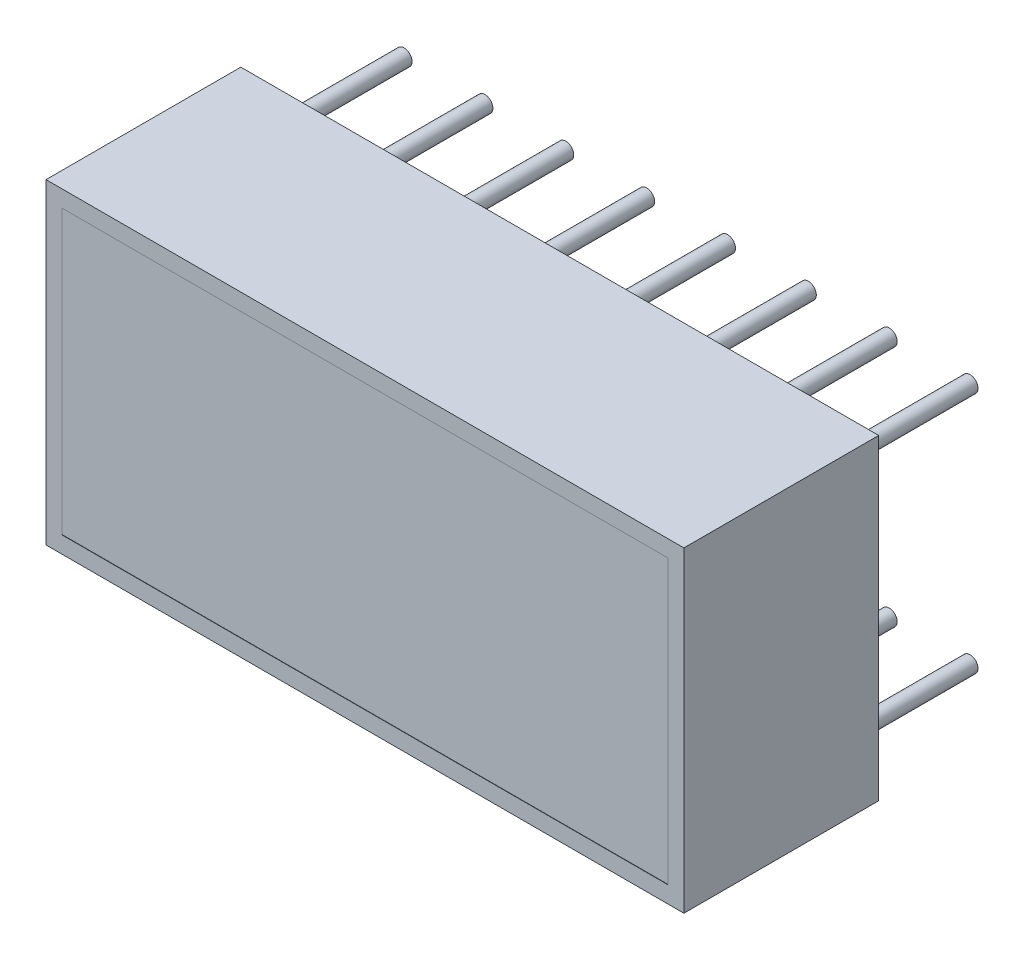
ISO-10303-21;
HEADER;
FILE_DESCRIPTION(('STEP AP214'),'2;1');
FILE_NAME('part.step','',(''),(''),'','','');
FILE_SCHEMA(('AUTOMOTIVE_DESIGN { 1 0 10303 214 1 1 1 1 }'));
ENDSEC;
DATA;
#1=APPLICATION_CONTEXT('core data for automotive mechanical design processes');
#2=APPLICATION_PROTOCOL_DEFINITION('international standard','automotive_design',2000,#1);
#3=PRODUCT_CONTEXT('',#1,'mechanical');
#4=PRODUCT('Part','Part','',(#3));
#5=PRODUCT_RELATED_PRODUCT_CATEGORY('part','',(#4));
#6=PRODUCT_DEFINITION_FORMATION('','',#4);
#7=PRODUCT_DEFINITION_CONTEXT('part definition',#1,'design');
#8=PRODUCT_DEFINITION('design','',#6,#7);
#9=PRODUCT_DEFINITION_SHAPE('','',#8);
#10=(LENGTH_UNIT() NAMED_UNIT(*) SI_UNIT(.MILLI.,.METRE.));
#11=(NAMED_UNIT(*) PLANE_ANGLE_UNIT() SI_UNIT($,.RADIAN.));
#12=(NAMED_UNIT(*) SI_UNIT($,.STERADIAN.) SOLID_ANGLE_UNIT());
#13=UNCERTAINTY_MEASURE_WITH_UNIT(LENGTH_MEASURE(1.E-05),#10,'distance_accuracy_value','');
#14=(GEOMETRIC_REPRESENTATION_CONTEXT(3) GLOBAL_UNCERTAINTY_ASSIGNED_CONTEXT((#13)) GLOBAL_UNIT_ASSIGNED_CONTEXT((#10,
#11,#12)) REPRESENTATION_CONTEXT('',''));
#15=CARTESIAN_POINT('',(0.,0.,0.));
#16=DIRECTION('',(0.,0.,1.));
#17=DIRECTION('',(1.,0.,0.));
#18=AXIS2_PLACEMENT_3D('',#15,#16,#17);
#19=CARTESIAN_POINT('',(8.89,3.81,-4.));
#20=DIRECTION('',(0.,0.,-1.));
#21=DIRECTION('',(-1.,0.,0.));
#22=AXIS2_PLACEMENT_3D('',#19,#20,#21);
#23=PLANE('',#22);
#24=CARTESIAN_POINT('',(8.89,3.81,-4.));
#25=DIRECTION('',(0.,0.,-1.));
#26=DIRECTION('',(-1.,0.,0.));
#27=AXIS2_PLACEMENT_3D('',#24,#25,#26);
#28=CIRCLE('',#27,0.25);
#29=CARTESIAN_POINT('',(8.64,3.81,-4.));
#30=VERTEX_POINT('',#29);
#31=EDGE_CURVE('E11',#30,#30,#28,.T.);
#32=ORIENTED_EDGE('',*,*,#31,.T.);
#33=EDGE_LOOP('',(#32));
#34=FACE_BOUND('',#33,.T.);
#35=ADVANCED_FACE('F33',(#34),#23,.T.);
#36=CARTESIAN_POINT('',(8.89,3.81,-4.));
#37=DIRECTION('',(0.,0.,1.));
#38=DIRECTION('',(1.,0.,0.));
#39=AXIS2_PLACEMENT_3D('',#36,#37,#38);
#40=CYLINDRICAL_SURFACE('',#39,0.25);
#41=ORIENTED_EDGE('',*,*,#31,.F.);
#42=EDGE_LOOP('',(#41));
#43=FACE_BOUND('',#42,.T.);
#44=CARTESIAN_POINT('',(8.89,3.81,0.));
#45=DIRECTION('',(0.,0.,-1.));
#46=DIRECTION('',(-1.,0.,0.));
#47=AXIS2_PLACEMENT_3D('',#44,#45,#46);
#48=CIRCLE('',#47,0.25);
#49=CARTESIAN_POINT('',(8.64,3.81,0.));
#50=VERTEX_POINT('',#49);
#51=EDGE_CURVE('E40',#50,#50,#48,.T.);
#52=ORIENTED_EDGE('',*,*,#51,.T.);
#53=EDGE_LOOP('',(#52));
#54=FACE_BOUND('',#53,.T.);
#55=ADVANCED_FACE('F260',(#43,#54),#40,.T.);
#56=CARTESIAN_POINT('',(6.35,3.81,-4.));
#57=DIRECTION('',(0.,0.,-1.));
#58=DIRECTION('',(-1.,0.,0.));
#59=AXIS2_PLACEMENT_3D('',#56,#57,#58);
#60=PLANE('',#59);
#61=CARTESIAN_POINT('',(6.35,3.81,-4.));
#62=DIRECTION('',(0.,0.,-1.));
#63=DIRECTION('',(-1.,0.,0.));
#64=AXIS2_PLACEMENT_3D('',#61,#62,#63);
#65=CIRCLE('',#64,0.25);
#66=CARTESIAN_POINT('',(6.1,3.81,-4.));
#67=VERTEX_POINT('',#66);
#68=EDGE_CURVE('E255',#67,#67,#65,.T.);
#69=ORIENTED_EDGE('',*,*,#68,.T.);
#70=EDGE_LOOP('',(#69));
#71=FACE_BOUND('',#70,.T.);
#72=ADVANCED_FACE('F286',(#71),#60,.T.);
#73=CARTESIAN_POINT('',(6.35,3.81,-4.));
#74=DIRECTION('',(0.,0.,1.));
#75=DIRECTION('',(1.,0.,0.));
#76=AXIS2_PLACEMENT_3D('',#73,#74,#75);
#77=CYLINDRICAL_SURFACE('',#76,0.25);
#78=ORIENTED_EDGE('',*,*,#68,.F.);
#79=EDGE_LOOP('',(#78));
#80=FACE_BOUND('',#79,.T.);
#81=CARTESIAN_POINT('',(6.35,3.81,0.));
#82=DIRECTION('',(0.,0.,-1.));
#83=DIRECTION('',(-1.,0.,0.));
#84=AXIS2_PLACEMENT_3D('',#81,#82,#83);
#85=CIRCLE('',#84,0.25);
#86=CARTESIAN_POINT('',(6.1,3.81,0.));
#87=VERTEX_POINT('',#86);
#88=EDGE_CURVE('E252',#87,#87,#85,.T.);
#89=ORIENTED_EDGE('',*,*,#88,.T.);
#90=EDGE_LOOP('',(#89));
#91=FACE_BOUND('',#90,.T.);
#92=ADVANCED_FACE('F292',(#80,#91),#77,.T.);
#93=CARTESIAN_POINT('',(3.81,3.81,-4.));
#94=DIRECTION('',(0.,0.,-1.));
#95=DIRECTION('',(-1.,0.,0.));
#96=AXIS2_PLACEMENT_3D('',#93,#94,#95);
#97=PLANE('',#96);
#98=CARTESIAN_POINT('',(3.81,3.81,-4.));
#99=DIRECTION('',(0.,0.,-1.));
#100=DIRECTION('',(-1.,0.,0.));
#101=AXIS2_PLACEMENT_3D('',#98,#99,#100);
#102=CIRCLE('',#101,0.25);
#103=CARTESIAN_POINT('',(3.56,3.81,-4.));
#104=VERTEX_POINT('',#103);
#105=EDGE_CURVE('E249',#104,#104,#102,.T.);
#106=ORIENTED_EDGE('',*,*,#105,.T.);
#107=EDGE_LOOP('',(#106));
#108=FACE_BOUND('',#107,.T.);
#109=ADVANCED_FACE('F298',(#108),#97,.T.);
#110=CARTESIAN_POINT('',(3.81,3.81,-4.));
#111=DIRECTION('',(0.,0.,1.));
#112=DIRECTION('',(1.,0.,0.));
#113=AXIS2_PLACEMENT_3D('',#110,#111,#112);
#114=CYLINDRICAL_SURFACE('',#113,0.25);
#115=ORIENTED_EDGE('',*,*,#105,.F.);
#116=EDGE_LOOP('',(#115));
#117=FACE_BOUND('',#116,.T.);
#118=CARTESIAN_POINT('',(3.81,3.81,0.));
#119=DIRECTION('',(0.,0.,-1.));
#120=DIRECTION('',(-1.,0.,0.));
#121=AXIS2_PLACEMENT_3D('',#118,#119,#120);
#122=CIRCLE('',#121,0.25);
#123=CARTESIAN_POINT('',(3.56,3.81,0.));
#124=VERTEX_POINT('',#123);
#125=EDGE_CURVE('E246',#124,#124,#122,.T.);
#126=ORIENTED_EDGE('',*,*,#125,.T.);
#127=EDGE_LOOP('',(#126));
#128=FACE_BOUND('',#127,.T.);
#129=ADVANCED_FACE('F302',(#117,#128),#114,.T.);
#130=CARTESIAN_POINT('',(1.27,3.81,-4.));
#131=DIRECTION('',(0.,0.,-1.));
#132=DIRECTION('',(-1.,0.,0.));
#133=AXIS2_PLACEMENT_3D('',#130,#131,#132);
#134=PLANE('',#133);
#135=CARTESIAN_POINT('',(1.27,3.81,-4.));
#136=DIRECTION('',(0.,0.,-1.));
#137=DIRECTION('',(-1.,0.,0.));
#138=AXIS2_PLACEMENT_3D('',#135,#136,#137);
#139=CIRCLE('',#138,0.25);
#140=CARTESIAN_POINT('',(1.02,3.81,-4.));
#141=VERTEX_POINT('',#140);
#142=EDGE_CURVE('E243',#141,#141,#139,.T.);
#143=ORIENTED_EDGE('',*,*,#142,.T.);
#144=EDGE_LOOP('',(#143));
#145=FACE_BOUND('',#144,.T.);
#146=ADVANCED_FACE('F306',(#145),#134,.T.);
#147=CARTESIAN_POINT('',(1.27,3.81,-4.));
#148=DIRECTION('',(0.,0.,1.));
#149=DIRECTION('',(1.,0.,0.));
#150=AXIS2_PLACEMENT_3D('',#147,#148,#149);
#151=CYLINDRICAL_SURFACE('',#150,0.25);
#152=ORIENTED_EDGE('',*,*,#142,.F.);
#153=EDGE_LOOP('',(#152));
#154=FACE_BOUND('',#153,.T.);
#155=CARTESIAN_POINT('',(1.27,3.81,0.));
#156=DIRECTION('',(0.,0.,-1.));
#157=DIRECTION('',(-1.,0.,0.));
#158=AXIS2_PLACEMENT_3D('',#155,#156,#157);
#159=CIRCLE('',#158,0.25);
#160=CARTESIAN_POINT('',(1.02,3.81,0.));
#161=VERTEX_POINT('',#160);
#162=EDGE_CURVE('E240',#161,#161,#159,.T.);
#163=ORIENTED_EDGE('',*,*,#162,.T.);
#164=EDGE_LOOP('',(#163));
#165=FACE_BOUND('',#164,.T.);
#166=ADVANCED_FACE('F310',(#154,#165),#151,.T.);
#167=CARTESIAN_POINT('',(-1.27,3.81,-4.));
#168=DIRECTION('',(0.,0.,-1.));
#169=DIRECTION('',(-1.,0.,0.));
#170=AXIS2_PLACEMENT_3D('',#167,#168,#169);
#171=PLANE('',#170);
#172=CARTESIAN_POINT('',(-1.27,3.81,-4.));
#173=DIRECTION('',(0.,0.,-1.));
#174=DIRECTION('',(-1.,0.,0.));
#175=AXIS2_PLACEMENT_3D('',#172,#173,#174);
#176=CIRCLE('',#175,0.25);
#177=CARTESIAN_POINT('',(-1.52,3.81,-4.));
#178=VERTEX_POINT('',#177);
#179=EDGE_CURVE('E237',#178,#178,#176,.T.);
#180=ORIENTED_EDGE('',*,*,#179,.T.);
#181=EDGE_LOOP('',(#180));
#182=FACE_BOUND('',#181,.T.);
#183=ADVANCED_FACE('F314',(#182),#171,.T.);
#184=CARTESIAN_POINT('',(-1.27,3.81,-4.));
#185=DIRECTION('',(0.,0.,1.));
#186=DIRECTION('',(1.,0.,0.));
#187=AXIS2_PLACEMENT_3D('',#184,#185,#186);
#188=CYLINDRICAL_SURFACE('',#187,0.25);
#189=ORIENTED_EDGE('',*,*,#179,.F.);
#190=EDGE_LOOP('',(#189));
#191=FACE_BOUND('',#190,.T.);
#192=CARTESIAN_POINT('',(-1.27,3.81,0.));
#193=DIRECTION('',(0.,0.,-1.));
#194=DIRECTION('',(-1.,0.,0.));
#195=AXIS2_PLACEMENT_3D('',#192,#193,#194);
#196=CIRCLE('',#195,0.25);
#197=CARTESIAN_POINT('',(-1.52,3.81,0.));
#198=VERTEX_POINT('',#197);
#199=EDGE_CURVE('E234',#198,#198,#196,.T.);
#200=ORIENTED_EDGE('',*,*,#199,.T.);
#201=EDGE_LOOP('',(#200));
#202=FACE_BOUND('',#201,.T.);
#203=ADVANCED_FACE('F318',(#191,#202),#188,.T.);
#204=CARTESIAN_POINT('',(-3.81,3.81,-4.));
#205=DIRECTION('',(0.,0.,-1.));
#206=DIRECTION('',(-1.,0.,0.));
#207=AXIS2_PLACEMENT_3D('',#204,#205,#206);
#208=PLANE('',#207);
#209=CARTESIAN_POINT('',(-3.81,3.81,-4.));
#210=DIRECTION('',(0.,0.,-1.));
#211=DIRECTION('',(-1.,0.,0.));
#212=AXIS2_PLACEMENT_3D('',#209,#210,#211);
#213=CIRCLE('',#212,0.25);
#214=CARTESIAN_POINT('',(-4.06,3.81,-4.));
#215=VERTEX_POINT('',#214);
#216=EDGE_CURVE('E231',#215,#215,#213,.T.);
#217=ORIENTED_EDGE('',*,*,#216,.T.);
#218=EDGE_LOOP('',(#217));
#219=FACE_BOUND('',#218,.T.);
#220=ADVANCED_FACE('F322',(#219),#208,.T.);
#221=CARTESIAN_POINT('',(-3.81,3.81,-4.));
#222=DIRECTION('',(0.,0.,1.));
#223=DIRECTION('',(1.,0.,0.));
#224=AXIS2_PLACEMENT_3D('',#221,#222,#223);
#225=CYLINDRICAL_SURFACE('',#224,0.25);
#226=ORIENTED_EDGE('',*,*,#216,.F.);
#227=EDGE_LOOP('',(#226));
#228=FACE_BOUND('',#227,.T.);
#229=CARTESIAN_POINT('',(-3.81,3.81,0.));
#230=DIRECTION('',(0.,0.,-1.));
#231=DIRECTION('',(-1.,0.,0.));
#232=AXIS2_PLACEMENT_3D('',#229,#230,#231);
#233=CIRCLE('',#232,0.25);
#234=CARTESIAN_POINT('',(-4.06,3.81,0.));
#235=VERTEX_POINT('',#234);
#236=EDGE_CURVE('E228',#235,#235,#233,.T.);
#237=ORIENTED_EDGE('',*,*,#236,.T.);
#238=EDGE_LOOP('',(#237));
#239=FACE_BOUND('',#238,.T.);
#240=ADVANCED_FACE('F326',(#228,#239),#225,.T.);
#241=CARTESIAN_POINT('',(-6.35,3.81,-4.));
#242=DIRECTION('',(0.,0.,-1.));
#243=DIRECTION('',(-1.,0.,0.));
#244=AXIS2_PLACEMENT_3D('',#241,#242,#243);
#245=PLANE('',#244);
#246=CARTESIAN_POINT('',(-6.35,3.81,-4.));
#247=DIRECTION('',(0.,0.,-1.));
#248=DIRECTION('',(-1.,0.,0.));
#249=AXIS2_PLACEMENT_3D('',#246,#247,#248);
#250=CIRCLE('',#249,0.25);
#251=CARTESIAN_POINT('',(-6.6,3.81,-4.));
#252=VERTEX_POINT('',#251);
#253=EDGE_CURVE('E225',#252,#252,#250,.T.);
#254=ORIENTED_EDGE('',*,*,#253,.T.);
#255=EDGE_LOOP('',(#254));
#256=FACE_BOUND('',#255,.T.);
#257=ADVANCED_FACE('F330',(#256),#245,.T.);
#258=CARTESIAN_POINT('',(-6.35,3.81,-4.));
#259=DIRECTION('',(0.,0.,1.));
#260=DIRECTION('',(1.,0.,0.));
#261=AXIS2_PLACEMENT_3D('',#258,#259,#260);
#262=CYLINDRICAL_SURFACE('',#261,0.25);
#263=ORIENTED_EDGE('',*,*,#253,.F.);
#264=EDGE_LOOP('',(#263));
#265=FACE_BOUND('',#264,.T.);
#266=CARTESIAN_POINT('',(-6.35,3.81,0.));
#267=DIRECTION('',(0.,0.,-1.));
#268=DIRECTION('',(-1.,0.,0.));
#269=AXIS2_PLACEMENT_3D('',#266,#267,#268);
#270=CIRCLE('',#269,0.25);
#271=CARTESIAN_POINT('',(-6.6,3.81,0.));
#272=VERTEX_POINT('',#271);
#273=EDGE_CURVE('E222',#272,#272,#270,.T.);
#274=ORIENTED_EDGE('',*,*,#273,.T.);
#275=EDGE_LOOP('',(#274));
#276=FACE_BOUND('',#275,.T.);
#277=ADVANCED_FACE('F334',(#265,#276),#262,.T.);
#278=CARTESIAN_POINT('',(-8.89,3.81,-4.));
#279=DIRECTION('',(0.,0.,-1.));
#280=DIRECTION('',(-1.,0.,0.));
#281=AXIS2_PLACEMENT_3D('',#278,#279,#280);
#282=PLANE('',#281);
#283=CARTESIAN_POINT('',(-8.89,3.81,-4.));
#284=DIRECTION('',(0.,0.,-1.));
#285=DIRECTION('',(-1.,0.,0.));
#286=AXIS2_PLACEMENT_3D('',#283,#284,#285);
#287=CIRCLE('',#286,0.25);
#288=CARTESIAN_POINT('',(-9.14,3.81,-4.));
#289=VERTEX_POINT('',#288);
#290=EDGE_CURVE('E219',#289,#289,#287,.T.);
#291=ORIENTED_EDGE('',*,*,#290,.T.);
#292=EDGE_LOOP('',(#291));
#293=FACE_BOUND('',#292,.T.);
#294=ADVANCED_FACE('F338',(#293),#282,.T.);
#295=CARTESIAN_POINT('',(-8.89,3.81,-4.));
#296=DIRECTION('',(0.,0.,1.));
#297=DIRECTION('',(1.,0.,0.));
#298=AXIS2_PLACEMENT_3D('',#295,#296,#297);
#299=CYLINDRICAL_SURFACE('',#298,0.25);
#300=ORIENTED_EDGE('',*,*,#290,.F.);
#301=EDGE_LOOP('',(#300));
#302=FACE_BOUND('',#301,.T.);
#303=CARTESIAN_POINT('',(-8.89,3.81,0.));
#304=DIRECTION('',(0.,0.,-1.));
#305=DIRECTION('',(-1.,0.,0.));
#306=AXIS2_PLACEMENT_3D('',#303,#304,#305);
#307=CIRCLE('',#306,0.25);
#308=CARTESIAN_POINT('',(-9.14,3.81,0.));
#309=VERTEX_POINT('',#308);
#310=EDGE_CURVE('E216',#309,#309,#307,.T.);
#311=ORIENTED_EDGE('',*,*,#310,.T.);
#312=EDGE_LOOP('',(#311));
#313=FACE_BOUND('',#312,.T.);
#314=ADVANCED_FACE('F342',(#302,#313),#299,.T.);
#315=CARTESIAN_POINT('',(8.89,-3.81,-4.));
#316=DIRECTION('',(0.,0.,-1.));
#317=DIRECTION('',(-1.,0.,0.));
#318=AXIS2_PLACEMENT_3D('',#315,#316,#317);
#319=PLANE('',#318);
#320=CARTESIAN_POINT('',(8.89,-3.81,-4.));
#321=DIRECTION('',(0.,0.,-1.));
#322=DIRECTION('',(-1.,0.,0.));
#323=AXIS2_PLACEMENT_3D('',#320,#321,#322);
#324=CIRCLE('',#323,0.25);
#325=CARTESIAN_POINT('',(8.64,-3.81,-4.));
#326=VERTEX_POINT('',#325);
#327=EDGE_CURVE('E213',#326,#326,#324,.T.);
#328=ORIENTED_EDGE('',*,*,#327,.T.);
#329=EDGE_LOOP('',(#328));
#330=FACE_BOUND('',#329,.T.);
#331=ADVANCED_FACE('F346',(#330),#319,.T.);
#332=CARTESIAN_POINT('',(8.89,-3.81,-4.));
#333=DIRECTION('',(0.,0.,1.));
#334=DIRECTION('',(1.,0.,0.));
#335=AXIS2_PLACEMENT_3D('',#332,#333,#334);
#336=CYLINDRICAL_SURFACE('',#335,0.25);
#337=ORIENTED_EDGE('',*,*,#327,.F.);
#338=EDGE_LOOP('',(#337));
#339=FACE_BOUND('',#338,.T.);
#340=CARTESIAN_POINT('',(8.89,-3.81,0.));
#341=DIRECTION('',(0.,0.,-1.));
#342=DIRECTION('',(-1.,0.,0.));
#343=AXIS2_PLACEMENT_3D('',#340,#341,#342);
#344=CIRCLE('',#343,0.25);
#345=CARTESIAN_POINT('',(8.64,-3.81,0.));
#346=VERTEX_POINT('',#345);
#347=EDGE_CURVE('E210',#346,#346,#344,.T.);
#348=ORIENTED_EDGE('',*,*,#347,.T.);
#349=EDGE_LOOP('',(#348));
#350=FACE_BOUND('',#349,.T.);
#351=ADVANCED_FACE('F350',(#339,#350),#336,.T.);
#352=CARTESIAN_POINT('',(6.35,-3.81,-4.));
#353=DIRECTION('',(0.,0.,-1.));
#354=DIRECTION('',(-1.,0.,0.));
#355=AXIS2_PLACEMENT_3D('',#352,#353,#354);
#356=PLANE('',#355);
#357=CARTESIAN_POINT('',(6.35,-3.81,-4.));
#358=DIRECTION('',(0.,0.,-1.));
#359=DIRECTION('',(-1.,0.,0.));
#360=AXIS2_PLACEMENT_3D('',#357,#358,#359);
#361=CIRCLE('',#360,0.25);
#362=CARTESIAN_POINT('',(6.1,-3.81,-4.));
#363=VERTEX_POINT('',#362);
#364=EDGE_CURVE('E207',#363,#363,#361,.T.);
#365=ORIENTED_EDGE('',*,*,#364,.T.);
#366=EDGE_LOOP('',(#365));
#367=FACE_BOUND('',#366,.T.);
#368=ADVANCED_FACE('F354',(#367),#356,.T.);
#369=CARTESIAN_POINT('',(6.35,-3.81,-4.));
#370=DIRECTION('',(0.,0.,1.));
#371=DIRECTION('',(1.,0.,0.));
#372=AXIS2_PLACEMENT_3D('',#369,#370,#371);
#373=CYLINDRICAL_SURFACE('',#372,0.25);
#374=ORIENTED_EDGE('',*,*,#364,.F.);
#375=EDGE_LOOP('',(#374));
#376=FACE_BOUND('',#375,.T.);
#377=CARTESIAN_POINT('',(6.35,-3.81,0.));
#378=DIRECTION('',(0.,0.,-1.));
#379=DIRECTION('',(-1.,0.,0.));
#380=AXIS2_PLACEMENT_3D('',#377,#378,#379);
#381=CIRCLE('',#380,0.25);
#382=CARTESIAN_POINT('',(6.1,-3.81,0.));
#383=VERTEX_POINT('',#382);
#384=EDGE_CURVE('E204',#383,#383,#381,.T.);
#385=ORIENTED_EDGE('',*,*,#384,.T.);
#386=EDGE_LOOP('',(#385));
#387=FACE_BOUND('',#386,.T.);
#388=ADVANCED_FACE('F358',(#376,#387),#373,.T.);
#389=CARTESIAN_POINT('',(3.81,-3.81,-4.));
#390=DIRECTION('',(0.,0.,-1.));
#391=DIRECTION('',(-1.,0.,0.));
#392=AXIS2_PLACEMENT_3D('',#389,#390,#391);
#393=PLANE('',#392);
#394=CARTESIAN_POINT('',(3.81,-3.81,-4.));
#395=DIRECTION('',(0.,0.,-1.));
#396=DIRECTION('',(-1.,0.,0.));
#397=AXIS2_PLACEMENT_3D('',#394,#395,#396);
#398=CIRCLE('',#397,0.25);
#399=CARTESIAN_POINT('',(3.56,-3.81,-4.));
#400=VERTEX_POINT('',#399);
#401=EDGE_CURVE('E201',#400,#400,#398,.T.);
#402=ORIENTED_EDGE('',*,*,#401,.T.);
#403=EDGE_LOOP('',(#402));
#404=FACE_BOUND('',#403,.T.);
#405=ADVANCED_FACE('F362',(#404),#393,.T.);
#406=CARTESIAN_POINT('',(3.81,-3.81,-4.));
#407=DIRECTION('',(0.,0.,1.));
#408=DIRECTION('',(1.,0.,0.));
#409=AXIS2_PLACEMENT_3D('',#406,#407,#408);
#410=CYLINDRICAL_SURFACE('',#409,0.25);
#411=ORIENTED_EDGE('',*,*,#401,.F.);
#412=EDGE_LOOP('',(#411));
#413=FACE_BOUND('',#412,.T.);
#414=CARTESIAN_POINT('',(3.81,-3.81,0.));
#415=DIRECTION('',(0.,0.,-1.));
#416=DIRECTION('',(-1.,0.,0.));
#417=AXIS2_PLACEMENT_3D('',#414,#415,#416);
#418=CIRCLE('',#417,0.25);
#419=CARTESIAN_POINT('',(3.56,-3.81,0.));
#420=VERTEX_POINT('',#419);
#421=EDGE_CURVE('E198',#420,#420,#418,.T.);
#422=ORIENTED_EDGE('',*,*,#421,.T.);
#423=EDGE_LOOP('',(#422));
#424=FACE_BOUND('',#423,.T.);
#425=ADVANCED_FACE('F366',(#413,#424),#410,.T.);
#426=CARTESIAN_POINT('',(1.27,-3.81,-4.));
#427=DIRECTION('',(0.,0.,-1.));
#428=DIRECTION('',(-1.,0.,0.));
#429=AXIS2_PLACEMENT_3D('',#426,#427,#428);
#430=PLANE('',#429);
#431=CARTESIAN_POINT('',(1.27,-3.81,-4.));
#432=DIRECTION('',(0.,0.,-1.));
#433=DIRECTION('',(-1.,0.,0.));
#434=AXIS2_PLACEMENT_3D('',#431,#432,#433);
#435=CIRCLE('',#434,0.25);
#436=CARTESIAN_POINT('',(1.02,-3.81,-4.));
#437=VERTEX_POINT('',#436);
#438=EDGE_CURVE('E195',#437,#437,#435,.T.);
#439=ORIENTED_EDGE('',*,*,#438,.T.);
#440=EDGE_LOOP('',(#439));
#441=FACE_BOUND('',#440,.T.);
#442=ADVANCED_FACE('F370',(#441),#430,.T.);
#443=CARTESIAN_POINT('',(1.27,-3.81,-4.));
#444=DIRECTION('',(0.,0.,1.));
#445=DIRECTION('',(1.,0.,0.));
#446=AXIS2_PLACEMENT_3D('',#443,#444,#445);
#447=CYLINDRICAL_SURFACE('',#446,0.25);
#448=ORIENTED_EDGE('',*,*,#438,.F.);
#449=EDGE_LOOP('',(#448));
#450=FACE_BOUND('',#449,.T.);
#451=CARTESIAN_POINT('',(1.27,-3.81,0.));
#452=DIRECTION('',(0.,0.,-1.));
#453=DIRECTION('',(-1.,0.,0.));
#454=AXIS2_PLACEMENT_3D('',#451,#452,#453);
#455=CIRCLE('',#454,0.25);
#456=CARTESIAN_POINT('',(1.02,-3.81,0.));
#457=VERTEX_POINT('',#456);
#458=EDGE_CURVE('E192',#457,#457,#455,.T.);
#459=ORIENTED_EDGE('',*,*,#458,.T.);
#460=EDGE_LOOP('',(#459));
#461=FACE_BOUND('',#460,.T.);
#462=ADVANCED_FACE('F374',(#450,#461),#447,.T.);
#463=CARTESIAN_POINT('',(-1.27,-3.81,-4.));
#464=DIRECTION('',(0.,0.,-1.));
#465=DIRECTION('',(-1.,0.,0.));
#466=AXIS2_PLACEMENT_3D('',#463,#464,#465);
#467=PLANE('',#466);
#468=CARTESIAN_POINT('',(-1.27,-3.81,-4.));
#469=DIRECTION('',(0.,0.,-1.));
#470=DIRECTION('',(-1.,0.,0.));
#471=AXIS2_PLACEMENT_3D('',#468,#469,#470);
#472=CIRCLE('',#471,0.25);
#473=CARTESIAN_POINT('',(-1.52,-3.81,-4.));
#474=VERTEX_POINT('',#473);
#475=EDGE_CURVE('E189',#474,#474,#472,.T.);
#476=ORIENTED_EDGE('',*,*,#475,.T.);
#477=EDGE_LOOP('',(#476));
#478=FACE_BOUND('',#477,.T.);
#479=ADVANCED_FACE('F378',(#478),#467,.T.);
#480=CARTESIAN_POINT('',(-1.27,-3.81,-4.));
#481=DIRECTION('',(0.,0.,1.));
#482=DIRECTION('',(1.,0.,0.));
#483=AXIS2_PLACEMENT_3D('',#480,#481,#482);
#484=CYLINDRICAL_SURFACE('',#483,0.25);
#485=ORIENTED_EDGE('',*,*,#475,.F.);
#486=EDGE_LOOP('',(#485));
#487=FACE_BOUND('',#486,.T.);
#488=CARTESIAN_POINT('',(-1.27,-3.81,0.));
#489=DIRECTION('',(0.,0.,-1.));
#490=DIRECTION('',(-1.,0.,0.));
#491=AXIS2_PLACEMENT_3D('',#488,#489,#490);
#492=CIRCLE('',#491,0.25);
#493=CARTESIAN_POINT('',(-1.52,-3.81,0.));
#494=VERTEX_POINT('',#493);
#495=EDGE_CURVE('E186',#494,#494,#492,.T.);
#496=ORIENTED_EDGE('',*,*,#495,.T.);
#497=EDGE_LOOP('',(#496));
#498=FACE_BOUND('',#497,.T.);
#499=ADVANCED_FACE('F382',(#487,#498),#484,.T.);
#500=CARTESIAN_POINT('',(-3.81,-3.81,-4.));
#501=DIRECTION('',(0.,0.,-1.));
#502=DIRECTION('',(-1.,0.,0.));
#503=AXIS2_PLACEMENT_3D('',#500,#501,#502);
#504=PLANE('',#503);
#505=CARTESIAN_POINT('',(-3.81,-3.81,-4.));
#506=DIRECTION('',(0.,0.,-1.));
#507=DIRECTION('',(-1.,0.,0.));
#508=AXIS2_PLACEMENT_3D('',#505,#506,#507);
#509=CIRCLE('',#508,0.25);
#510=CARTESIAN_POINT('',(-4.06,-3.81,-4.));
#511=VERTEX_POINT('',#510);
#512=EDGE_CURVE('E183',#511,#511,#509,.T.);
#513=ORIENTED_EDGE('',*,*,#512,.T.);
#514=EDGE_LOOP('',(#513));
#515=FACE_BOUND('',#514,.T.);
#516=ADVANCED_FACE('F386',(#515),#504,.T.);
#517=CARTESIAN_POINT('',(-3.81,-3.81,-4.));
#518=DIRECTION('',(0.,0.,1.));
#519=DIRECTION('',(1.,0.,0.));
#520=AXIS2_PLACEMENT_3D('',#517,#518,#519);
#521=CYLINDRICAL_SURFACE('',#520,0.25);
#522=ORIENTED_EDGE('',*,*,#512,.F.);
#523=EDGE_LOOP('',(#522));
#524=FACE_BOUND('',#523,.T.);
#525=CARTESIAN_POINT('',(-3.81,-3.81,0.));
#526=DIRECTION('',(0.,0.,-1.));
#527=DIRECTION('',(-1.,0.,0.));
#528=AXIS2_PLACEMENT_3D('',#525,#526,#527);
#529=CIRCLE('',#528,0.25);
#530=CARTESIAN_POINT('',(-4.06,-3.81,0.));
#531=VERTEX_POINT('',#530);
#532=EDGE_CURVE('E180',#531,#531,#529,.T.);
#533=ORIENTED_EDGE('',*,*,#532,.T.);
#534=EDGE_LOOP('',(#533));
#535=FACE_BOUND('',#534,.T.);
#536=ADVANCED_FACE('F390',(#524,#535),#521,.T.);
#537=CARTESIAN_POINT('',(10.02,-4.97,6.12));
#538=DIRECTION('',(-1.,0.,0.));
#539=DIRECTION('',(0.,0.,1.));
#540=AXIS2_PLACEMENT_3D('',#537,#538,#539);
#541=PLANE('',#540);
#542=DIRECTION('',(0.,1.,0.));
#543=VECTOR('',#542,1.);
#544=CARTESIAN_POINT('',(10.02,-4.97,0.));
#545=LINE('',#544,#543);
#546=CARTESIAN_POINT('',(10.02,-4.97,0.));
#547=VERTEX_POINT('',#546);
#548=CARTESIAN_POINT('',(10.02,4.97,0.));
#549=VERTEX_POINT('',#548);
#550=EDGE_CURVE('E155',#547,#549,#545,.T.);
#551=ORIENTED_EDGE('',*,*,#550,.T.);
#552=DIRECTION('',(0.,0.,-1.));
#553=VECTOR('',#552,1.);
#554=CARTESIAN_POINT('',(10.02,4.97,6.12));
#555=LINE('',#554,#553);
#556=CARTESIAN_POINT('',(10.02,4.97,6.12));
#557=VERTEX_POINT('',#556);
#558=EDGE_CURVE('E178',#557,#549,#555,.T.);
#559=ORIENTED_EDGE('',*,*,#558,.F.);
#560=DIRECTION('',(0.,1.,0.));
#561=VECTOR('',#560,1.);
#562=CARTESIAN_POINT('',(10.02,-4.97,6.12));
#563=LINE('',#562,#561);
#564=CARTESIAN_POINT('',(10.02,-4.97,6.12));
#565=VERTEX_POINT('',#564);
#566=EDGE_CURVE('E158',#565,#557,#563,.T.);
#567=ORIENTED_EDGE('',*,*,#566,.F.);
#568=DIRECTION('',(0.,0.,-1.));
#569=VECTOR('',#568,1.);
#570=CARTESIAN_POINT('',(10.02,-4.97,6.12));
#571=LINE('',#570,#569);
#572=EDGE_CURVE('E164',#565,#547,#571,.T.);
#573=ORIENTED_EDGE('',*,*,#572,.T.);
#574=EDGE_LOOP('',(#551,#559,#567,#573));
#575=FACE_BOUND('',#574,.T.);
#576=ADVANCED_FACE('F394',(#575),#541,.F.);
#577=CARTESIAN_POINT('',(-10.02,4.97,6.12));
#578=DIRECTION('',(0.,-1.,0.));
#579=DIRECTION('',(0.,0.,-1.));
#580=AXIS2_PLACEMENT_3D('',#577,#578,#579);
#581=PLANE('',#580);
#582=DIRECTION('',(-1.,0.,0.));
#583=VECTOR('',#582,1.);
#584=CARTESIAN_POINT('',(-10.02,4.97,0.));
#585=LINE('',#584,#583);
#586=CARTESIAN_POINT('',(-10.02,4.97,0.));
#587=VERTEX_POINT('',#586);
#588=EDGE_CURVE('E167',#549,#587,#585,.T.);
#589=ORIENTED_EDGE('',*,*,#588,.T.);
#590=DIRECTION('',(0.,0.,-1.));
#591=VECTOR('',#590,1.);
#592=CARTESIAN_POINT('',(-10.02,4.97,6.12));
#593=LINE('',#592,#591);
#594=CARTESIAN_POINT('',(-10.02,4.97,6.12));
#595=VERTEX_POINT('',#594);
#596=EDGE_CURVE('E175',#595,#587,#593,.T.);
#597=ORIENTED_EDGE('',*,*,#596,.F.);
#598=DIRECTION('',(-1.,0.,0.));
#599=VECTOR('',#598,1.);
#600=CARTESIAN_POINT('',(-10.02,4.97,6.12));
#601=LINE('',#600,#599);
#602=EDGE_CURVE('E85',#557,#595,#601,.T.);
#603=ORIENTED_EDGE('',*,*,#602,.F.);
#604=ORIENTED_EDGE('',*,*,#558,.T.);
#605=EDGE_LOOP('',(#589,#597,#603,#604));
#606=FACE_BOUND('',#605,.T.);
#607=ADVANCED_FACE('F398',(#606),#581,.F.);
#608=CARTESIAN_POINT('',(-10.02,-4.97,6.12));
#609=DIRECTION('',(1.,0.,0.));
#610=DIRECTION('',(0.,0.,-1.));
#611=AXIS2_PLACEMENT_3D('',#608,#609,#610);
#612=PLANE('',#611);
#613=DIRECTION('',(0.,-1.,0.));
#614=VECTOR('',#613,1.);
#615=CARTESIAN_POINT('',(-10.02,-4.97,0.));
#616=LINE('',#615,#614);
#617=CARTESIAN_POINT('',(-10.02,-4.97,0.));
#618=VERTEX_POINT('',#617);
#619=EDGE_CURVE('E169',#587,#618,#616,.T.);
#620=ORIENTED_EDGE('',*,*,#619,.T.);
#621=DIRECTION('',(0.,0.,-1.));
#622=VECTOR('',#621,1.);
#623=CARTESIAN_POINT('',(-10.02,-4.97,6.12));
#624=LINE('',#623,#622);
#625=CARTESIAN_POINT('',(-10.02,-4.97,6.12));
#626=VERTEX_POINT('',#625);
#627=EDGE_CURVE('E173',#626,#618,#624,.T.);
#628=ORIENTED_EDGE('',*,*,#627,.F.);
#629=DIRECTION('',(0.,-1.,0.));
#630=VECTOR('',#629,1.);
#631=CARTESIAN_POINT('',(-10.02,-4.97,6.12));
#632=LINE('',#631,#630);
#633=EDGE_CURVE('E161',#595,#626,#632,.T.);
#634=ORIENTED_EDGE('',*,*,#633,.F.);
#635=ORIENTED_EDGE('',*,*,#596,.T.);
#636=EDGE_LOOP('',(#620,#628,#634,#635));
#637=FACE_BOUND('',#636,.T.);
#638=ADVANCED_FACE('F402',(#637),#612,.F.);
#639=CARTESIAN_POINT('',(-10.02,-4.97,6.12));
#640=DIRECTION('',(0.,1.,0.));
#641=DIRECTION('',(0.,0.,1.));
#642=AXIS2_PLACEMENT_3D('',#639,#640,#641);
#643=PLANE('',#642);
#644=DIRECTION('',(1.,0.,0.));
#645=VECTOR('',#644,1.);
#646=CARTESIAN_POINT('',(-10.02,-4.97,0.));
#647=LINE('',#646,#645);
#648=EDGE_CURVE('E77',#618,#547,#647,.T.);
#649=ORIENTED_EDGE('',*,*,#648,.T.);
#650=ORIENTED_EDGE('',*,*,#572,.F.);
#651=DIRECTION('',(1.,0.,0.));
#652=VECTOR('',#651,1.);
#653=CARTESIAN_POINT('',(-10.02,-4.97,6.12));
#654=LINE('',#653,#652);
#655=EDGE_CURVE('E56',#626,#565,#654,.T.);
#656=ORIENTED_EDGE('',*,*,#655,.F.);
#657=ORIENTED_EDGE('',*,*,#627,.T.);
#658=EDGE_LOOP('',(#649,#650,#656,#657));
#659=FACE_BOUND('',#658,.T.);
#660=ADVANCED_FACE('F275',(#659),#643,.F.);
#661=CARTESIAN_POINT('',(0.,0.,6.12));
#662=DIRECTION('',(0.,0.,-1.));
#663=DIRECTION('',(-1.,0.,0.));
#664=AXIS2_PLACEMENT_3D('',#661,#662,#663);
#665=PLANE('',#664);
#666=DIRECTION('',(1.,0.,0.));
#667=VECTOR('',#666,1.);
#668=CARTESIAN_POINT('',(9.525,-4.445,6.12));
#669=LINE('',#668,#667);
#670=CARTESIAN_POINT('',(-9.525,-4.445,6.12));
#671=VERTEX_POINT('',#670);
#672=CARTESIAN_POINT('',(9.525,-4.445,6.12));
#673=VERTEX_POINT('',#672);
#674=EDGE_CURVE('E136',#671,#673,#669,.T.);
#675=ORIENTED_EDGE('',*,*,#674,.F.);
#676=DIRECTION('',(0.,-1.,0.));
#677=VECTOR('',#676,1.);
#678=CARTESIAN_POINT('',(-9.525,4.445,6.12));
#679=LINE('',#678,#677);
#680=CARTESIAN_POINT('',(-9.525,4.445,6.12));
#681=VERTEX_POINT('',#680);
#682=EDGE_CURVE('E47',#681,#671,#679,.T.);
#683=ORIENTED_EDGE('',*,*,#682,.F.);
#684=DIRECTION('',(-1.,0.,0.));
#685=VECTOR('',#684,1.);
#686=CARTESIAN_POINT('',(9.525,4.445,6.12));
#687=LINE('',#686,#685);
#688=CARTESIAN_POINT('',(9.525,4.445,6.12));
#689=VERTEX_POINT('',#688);
#690=EDGE_CURVE('E127',#689,#681,#687,.T.);
#691=ORIENTED_EDGE('',*,*,#690,.F.);
#692=DIRECTION('',(0.,1.,0.));
#693=VECTOR('',#692,1.);
#694=CARTESIAN_POINT('',(9.525,4.445,6.12));
#695=LINE('',#694,#693);
#696=EDGE_CURVE('E130',#673,#689,#695,.T.);
#697=ORIENTED_EDGE('',*,*,#696,.F.);
#698=EDGE_LOOP('',(#675,#683,#691,#697));
#699=FACE_BOUND('',#698,.T.);
#700=ORIENTED_EDGE('',*,*,#566,.T.);
#701=ORIENTED_EDGE('',*,*,#602,.T.);
#702=ORIENTED_EDGE('',*,*,#633,.T.);
#703=ORIENTED_EDGE('',*,*,#655,.T.);
#704=EDGE_LOOP('',(#700,#701,#702,#703));
#705=FACE_BOUND('',#704,.T.);
#706=ADVANCED_FACE('F265',(#699,#705),#665,.F.);
#707=CARTESIAN_POINT('',(0.,0.,0.));
#708=DIRECTION('',(0.,0.,-1.));
#709=DIRECTION('',(-1.,0.,0.));
#710=AXIS2_PLACEMENT_3D('',#707,#708,#709);
#711=PLANE('',#710);
#712=CARTESIAN_POINT('',(-6.35,-3.81,0.));
#713=DIRECTION('',(0.,0.,-1.));
#714=DIRECTION('',(-1.,0.,0.));
#715=AXIS2_PLACEMENT_3D('',#712,#713,#714);
#716=CIRCLE('',#715,0.25);
#717=CARTESIAN_POINT('',(-6.6,-3.81,0.));
#718=VERTEX_POINT('',#717);
#719=EDGE_CURVE('E142',#718,#718,#716,.T.);
#720=ORIENTED_EDGE('',*,*,#719,.F.);
#721=EDGE_LOOP('',(#720));
#722=FACE_BOUND('',#721,.T.);
#723=CARTESIAN_POINT('',(-8.89,-3.81,0.));
#724=DIRECTION('',(0.,0.,-1.));
#725=DIRECTION('',(-1.,0.,0.));
#726=AXIS2_PLACEMENT_3D('',#723,#724,#725);
#727=CIRCLE('',#726,0.25);
#728=CARTESIAN_POINT('',(-9.14,-3.81,0.));
#729=VERTEX_POINT('',#728);
#730=EDGE_CURVE('E151',#729,#729,#727,.T.);
#731=ORIENTED_EDGE('',*,*,#730,.F.);
#732=EDGE_LOOP('',(#731));
#733=FACE_BOUND('',#732,.T.);
#734=ORIENTED_EDGE('',*,*,#550,.F.);
#735=ORIENTED_EDGE('',*,*,#648,.F.);
#736=ORIENTED_EDGE('',*,*,#619,.F.);
#737=ORIENTED_EDGE('',*,*,#588,.F.);
#738=EDGE_LOOP('',(#734,#735,#736,#737));
#739=FACE_BOUND('',#738,.T.);
#740=ORIENTED_EDGE('',*,*,#532,.F.);
#741=EDGE_LOOP('',(#740));
#742=FACE_BOUND('',#741,.T.);
#743=ORIENTED_EDGE('',*,*,#495,.F.);
#744=EDGE_LOOP('',(#743));
#745=FACE_BOUND('',#744,.T.);
#746=ORIENTED_EDGE('',*,*,#458,.F.);
#747=EDGE_LOOP('',(#746));
#748=FACE_BOUND('',#747,.T.);
#749=ORIENTED_EDGE('',*,*,#421,.F.);
#750=EDGE_LOOP('',(#749));
#751=FACE_BOUND('',#750,.T.);
#752=ORIENTED_EDGE('',*,*,#384,.F.);
#753=EDGE_LOOP('',(#752));
#754=FACE_BOUND('',#753,.T.);
#755=ORIENTED_EDGE('',*,*,#347,.F.);
#756=EDGE_LOOP('',(#755));
#757=FACE_BOUND('',#756,.T.);
#758=ORIENTED_EDGE('',*,*,#310,.F.);
#759=EDGE_LOOP('',(#758));
#760=FACE_BOUND('',#759,.T.);
#761=ORIENTED_EDGE('',*,*,#273,.F.);
#762=EDGE_LOOP('',(#761));
#763=FACE_BOUND('',#762,.T.);
#764=ORIENTED_EDGE('',*,*,#236,.F.);
#765=EDGE_LOOP('',(#764));
#766=FACE_BOUND('',#765,.T.);
#767=ORIENTED_EDGE('',*,*,#199,.F.);
#768=EDGE_LOOP('',(#767));
#769=FACE_BOUND('',#768,.T.);
#770=ORIENTED_EDGE('',*,*,#162,.F.);
#771=EDGE_LOOP('',(#770));
#772=FACE_BOUND('',#771,.T.);
#773=ORIENTED_EDGE('',*,*,#125,.F.);
#774=EDGE_LOOP('',(#773));
#775=FACE_BOUND('',#774,.T.);
#776=ORIENTED_EDGE('',*,*,#88,.F.);
#777=EDGE_LOOP('',(#776));
#778=FACE_BOUND('',#777,.T.);
#779=ORIENTED_EDGE('',*,*,#51,.F.);
#780=EDGE_LOOP('',(#779));
#781=FACE_BOUND('',#780,.T.);
#782=ADVANCED_FACE('F262',(#722,#733,#739,#742,#745,#748,#751,#754,#757,#760,#763,#766,#769,
#772,#775,#778,#781),#711,.T.);
#783=CARTESIAN_POINT('',(-8.89,-3.81,-4.));
#784=DIRECTION('',(0.,0.,1.));
#785=DIRECTION('',(1.,0.,0.));
#786=AXIS2_PLACEMENT_3D('',#783,#784,#785);
#787=CYLINDRICAL_SURFACE('',#786,0.25);
#788=CARTESIAN_POINT('',(-8.89,-3.81,-4.));
#789=DIRECTION('',(0.,0.,-1.));
#790=DIRECTION('',(-1.,0.,0.));
#791=AXIS2_PLACEMENT_3D('',#788,#789,#790);
#792=CIRCLE('',#791,0.25);
#793=CARTESIAN_POINT('',(-9.14,-3.81,-4.));
#794=VERTEX_POINT('',#793);
#795=EDGE_CURVE('E152',#794,#794,#792,.T.);
#796=ORIENTED_EDGE('',*,*,#795,.F.);
#797=EDGE_LOOP('',(#796));
#798=FACE_BOUND('',#797,.T.);
#799=ORIENTED_EDGE('',*,*,#730,.T.);
#800=EDGE_LOOP('',(#799));
#801=FACE_BOUND('',#800,.T.);
#802=ADVANCED_FACE('F264',(#798,#801),#787,.T.);
#803=CARTESIAN_POINT('',(-8.89,-3.81,-4.));
#804=DIRECTION('',(0.,0.,-1.));
#805=DIRECTION('',(-1.,0.,0.));
#806=AXIS2_PLACEMENT_3D('',#803,#804,#805);
#807=PLANE('',#806);
#808=ORIENTED_EDGE('',*,*,#795,.T.);
#809=EDGE_LOOP('',(#808));
#810=FACE_BOUND('',#809,.T.);
#811=ADVANCED_FACE('F272',(#810),#807,.T.);
#812=CARTESIAN_POINT('',(-6.35,-3.81,-4.));
#813=DIRECTION('',(0.,0.,1.));
#814=DIRECTION('',(1.,0.,0.));
#815=AXIS2_PLACEMENT_3D('',#812,#813,#814);
#816=CYLINDRICAL_SURFACE('',#815,0.25);
#817=CARTESIAN_POINT('',(-6.35,-3.81,-4.));
#818=DIRECTION('',(0.,0.,-1.));
#819=DIRECTION('',(-1.,0.,0.));
#820=AXIS2_PLACEMENT_3D('',#817,#818,#819);
#821=CIRCLE('',#820,0.25);
#822=CARTESIAN_POINT('',(-6.6,-3.81,-4.));
#823=VERTEX_POINT('',#822);
#824=EDGE_CURVE('E148',#823,#823,#821,.T.);
#825=ORIENTED_EDGE('',*,*,#824,.F.);
#826=EDGE_LOOP('',(#825));
#827=FACE_BOUND('',#826,.T.);
#828=ORIENTED_EDGE('',*,*,#719,.T.);
#829=EDGE_LOOP('',(#828));
#830=FACE_BOUND('',#829,.T.);
#831=ADVANCED_FACE('F472',(#827,#830),#816,.T.);
#832=CARTESIAN_POINT('',(-6.35,-3.81,-4.));
#833=DIRECTION('',(0.,0.,-1.));
#834=DIRECTION('',(-1.,0.,0.));
#835=AXIS2_PLACEMENT_3D('',#832,#833,#834);
#836=PLANE('',#835);
#837=ORIENTED_EDGE('',*,*,#824,.T.);
#838=EDGE_LOOP('',(#837));
#839=FACE_BOUND('',#838,.T.);
#840=ADVANCED_FACE('F422',(#839),#836,.T.);
#841=CARTESIAN_POINT('',(-9.525,4.445,6.11));
#842=DIRECTION('',(-1.,0.,0.));
#843=DIRECTION('',(0.,0.,1.));
#844=AXIS2_PLACEMENT_3D('',#841,#842,#843);
#845=PLANE('',#844);
#846=ORIENTED_EDGE('',*,*,#682,.T.);
#847=DIRECTION('',(0.,0.,1.));
#848=VECTOR('',#847,1.);
#849=CARTESIAN_POINT('',(-9.525,-4.445,6.11));
#850=LINE('',#849,#848);
#851=CARTESIAN_POINT('',(-9.525,-4.445,6.11));
#852=VERTEX_POINT('',#851);
#853=EDGE_CURVE('E105',#852,#671,#850,.T.);
#854=ORIENTED_EDGE('',*,*,#853,.F.);
#855=DIRECTION('',(0.,-1.,0.));
#856=VECTOR('',#855,1.);
#857=CARTESIAN_POINT('',(-9.525,4.445,6.11));
#858=LINE('',#857,#856);
#859=CARTESIAN_POINT('',(-9.525,4.445,6.11));
#860=VERTEX_POINT('',#859);
#861=EDGE_CURVE('E109',#860,#852,#858,.T.);
#862=ORIENTED_EDGE('',*,*,#861,.F.);
#863=DIRECTION('',(0.,0.,1.));
#864=VECTOR('',#863,1.);
#865=CARTESIAN_POINT('',(-9.525,4.445,6.11));
#866=LINE('',#865,#864);
#867=EDGE_CURVE('E140',#860,#681,#866,.T.);
#868=ORIENTED_EDGE('',*,*,#867,.T.);
#869=EDGE_LOOP('',(#846,#854,#862,#868));
#870=FACE_BOUND('',#869,.T.);
#871=ADVANCED_FACE('F107',(#870),#845,.F.);
#872=CARTESIAN_POINT('',(9.525,4.445,6.11));
#873=DIRECTION('',(0.,1.,0.));
#874=DIRECTION('',(-1.,0.,0.));
#875=AXIS2_PLACEMENT_3D('',#872,#873,#874);
#876=PLANE('',#875);
#877=ORIENTED_EDGE('',*,*,#690,.T.);
#878=ORIENTED_EDGE('',*,*,#867,.F.);
#879=DIRECTION('',(-1.,0.,0.));
#880=VECTOR('',#879,1.);
#881=CARTESIAN_POINT('',(9.525,4.445,6.11));
#882=LINE('',#881,#880);
#883=CARTESIAN_POINT('',(9.525,4.445,6.11));
#884=VERTEX_POINT('',#883);
#885=EDGE_CURVE('E115',#884,#860,#882,.T.);
#886=ORIENTED_EDGE('',*,*,#885,.F.);
#887=DIRECTION('',(0.,0.,1.));
#888=VECTOR('',#887,1.);
#889=CARTESIAN_POINT('',(9.525,4.445,6.11));
#890=LINE('',#889,#888);
#891=EDGE_CURVE('E143',#884,#689,#890,.T.);
#892=ORIENTED_EDGE('',*,*,#891,.T.);
#893=EDGE_LOOP('',(#877,#878,#886,#892));
#894=FACE_BOUND('',#893,.T.);
#895=ADVANCED_FACE('F431',(#894),#876,.F.);
#896=CARTESIAN_POINT('',(9.525,4.445,6.11));
#897=DIRECTION('',(1.,0.,0.));
#898=DIRECTION('',(0.,0.,-1.));
#899=AXIS2_PLACEMENT_3D('',#896,#897,#898);
#900=PLANE('',#899);
#901=ORIENTED_EDGE('',*,*,#696,.T.);
#902=ORIENTED_EDGE('',*,*,#891,.F.);
#903=DIRECTION('',(0.,1.,0.));
#904=VECTOR('',#903,1.);
#905=CARTESIAN_POINT('',(9.525,4.445,6.11));
#906=LINE('',#905,#904);
#907=CARTESIAN_POINT('',(9.525,-4.445,6.11));
#908=VERTEX_POINT('',#907);
#909=EDGE_CURVE('E123',#908,#884,#906,.T.);
#910=ORIENTED_EDGE('',*,*,#909,.F.);
#911=DIRECTION('',(0.,0.,1.));
#912=VECTOR('',#911,1.);
#913=CARTESIAN_POINT('',(9.525,-4.445,6.11));
#914=LINE('',#913,#912);
#915=EDGE_CURVE('E114',#908,#673,#914,.T.);
#916=ORIENTED_EDGE('',*,*,#915,.T.);
#917=EDGE_LOOP('',(#901,#902,#910,#916));
#918=FACE_BOUND('',#917,.T.);
#919=ADVANCED_FACE('F440',(#918),#900,.F.);
#920=CARTESIAN_POINT('',(9.525,-4.445,6.11));
#921=DIRECTION('',(0.,-1.,0.));
#922=DIRECTION('',(1.,0.,0.));
#923=AXIS2_PLACEMENT_3D('',#920,#921,#922);
#924=PLANE('',#923);
#925=ORIENTED_EDGE('',*,*,#674,.T.);
#926=ORIENTED_EDGE('',*,*,#915,.F.);
#927=DIRECTION('',(1.,0.,0.));
#928=VECTOR('',#927,1.);
#929=CARTESIAN_POINT('',(9.525,-4.445,6.11));
#930=LINE('',#929,#928);
#931=EDGE_CURVE('E118',#852,#908,#930,.T.);
#932=ORIENTED_EDGE('',*,*,#931,.F.);
#933=ORIENTED_EDGE('',*,*,#853,.T.);
#934=EDGE_LOOP('',(#925,#926,#932,#933));
#935=FACE_BOUND('',#934,.T.);
#936=ADVANCED_FACE('F119',(#935),#924,.F.);
#937=CARTESIAN_POINT('',(0.,0.,6.11));
#938=DIRECTION('',(0.,0.,-1.));
#939=DIRECTION('',(-1.,0.,0.));
#940=AXIS2_PLACEMENT_3D('',#937,#938,#939);
#941=PLANE('',#940);
#942=ORIENTED_EDGE('',*,*,#861,.T.);
#943=ORIENTED_EDGE('',*,*,#931,.T.);
#944=ORIENTED_EDGE('',*,*,#909,.T.);
#945=ORIENTED_EDGE('',*,*,#885,.T.);
#946=EDGE_LOOP('',(#942,#943,#944,#945));
#947=FACE_BOUND('',#946,.T.);
#948=ADVANCED_FACE('F125',(#947),#941,.F.);
#949=CLOSED_SHELL('',(#35,#55,#72,#92,#109,#129,#146,#166,#183,#203,#220,#240,#257,#277,#294,
#314,#331,#351,#368,#388,#405,#425,#442,#462,#479,#499,#516,#536,#576,#607,#638,#660,#706,#782,
#802,#811,#831,#840,#871,#895,#919,#936,#948));
#950=MANIFOLD_SOLID_BREP('B2',#949);
#951=ADVANCED_BREP_SHAPE_REPRESENTATION('',(#18,#950),#14);
#952=SHAPE_DEFINITION_REPRESENTATION(#9,#951);
ENDSEC;
END-ISO-10303-21;
